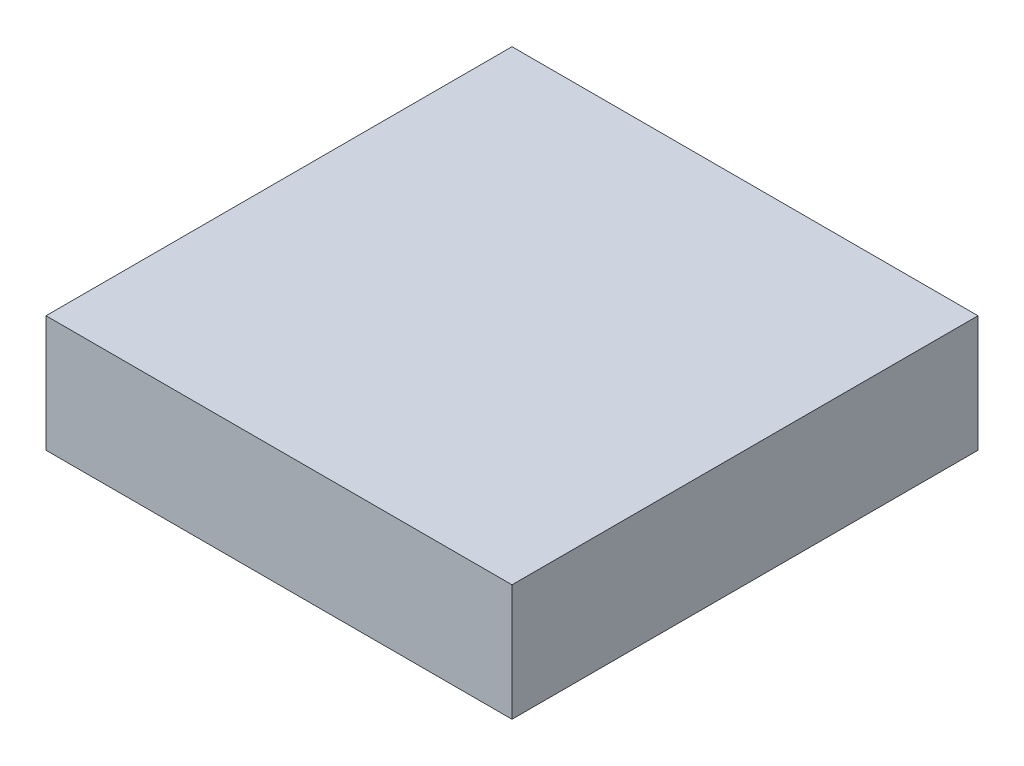
ISO-10303-21;
HEADER;
FILE_DESCRIPTION(('STEP AP214'),'2;1');
FILE_NAME('part.step','',(''),(''),'','','');
FILE_SCHEMA(('AUTOMOTIVE_DESIGN { 1 0 10303 214 1 1 1 1 }'));
ENDSEC;
DATA;
#1=APPLICATION_CONTEXT('core data for automotive mechanical design processes');
#2=APPLICATION_PROTOCOL_DEFINITION('international standard','automotive_design',2000,#1);
#3=PRODUCT_CONTEXT('',#1,'mechanical');
#4=PRODUCT('Part','Part','',(#3));
#5=PRODUCT_RELATED_PRODUCT_CATEGORY('part','',(#4));
#6=PRODUCT_DEFINITION_FORMATION('','',#4);
#7=PRODUCT_DEFINITION_CONTEXT('part definition',#1,'design');
#8=PRODUCT_DEFINITION('design','',#6,#7);
#9=PRODUCT_DEFINITION_SHAPE('','',#8);
#10=(LENGTH_UNIT() NAMED_UNIT(*) SI_UNIT(.MILLI.,.METRE.));
#11=(NAMED_UNIT(*) PLANE_ANGLE_UNIT() SI_UNIT($,.RADIAN.));
#12=(NAMED_UNIT(*) SI_UNIT($,.STERADIAN.) SOLID_ANGLE_UNIT());
#13=UNCERTAINTY_MEASURE_WITH_UNIT(LENGTH_MEASURE(1.E-05),#10,'distance_accuracy_value','');
#14=(GEOMETRIC_REPRESENTATION_CONTEXT(3) GLOBAL_UNCERTAINTY_ASSIGNED_CONTEXT((#13)) GLOBAL_UNIT_ASSIGNED_CONTEXT((#10,
#11,#12)) REPRESENTATION_CONTEXT('',''));
#15=CARTESIAN_POINT('',(0.,0.,0.));
#16=DIRECTION('',(0.,0.,1.));
#17=DIRECTION('',(1.,0.,0.));
#18=AXIS2_PLACEMENT_3D('',#15,#16,#17);
#19=CARTESIAN_POINT('',(0.,0.75,0.));
#20=DIRECTION('',(1.,0.,0.));
#21=DIRECTION('',(0.,0.,-1.));
#22=AXIS2_PLACEMENT_3D('',#19,#20,#21);
#23=PLANE('',#22);
#24=DIRECTION('',(0.,0.,1.));
#25=VECTOR('',#24,1.);
#26=CARTESIAN_POINT('',(0.,0.,0.));
#27=LINE('',#26,#25);
#28=CARTESIAN_POINT('',(0.,0.,-3.));
#29=VERTEX_POINT('',#28);
#30=CARTESIAN_POINT('',(0.,0.,0.));
#31=VERTEX_POINT('',#30);
#32=EDGE_CURVE('E95',#29,#31,#27,.T.);
#33=ORIENTED_EDGE('',*,*,#32,.T.);
#34=DIRECTION('',(0.,-1.,0.));
#35=VECTOR('',#34,1.);
#36=CARTESIAN_POINT('',(0.,0.75,0.));
#37=LINE('',#36,#35);
#38=CARTESIAN_POINT('',(0.,0.75,0.));
#39=VERTEX_POINT('',#38);
#40=EDGE_CURVE('E11',#39,#31,#37,.T.);
#41=ORIENTED_EDGE('',*,*,#40,.F.);
#42=DIRECTION('',(0.,0.,1.));
#43=VECTOR('',#42,1.);
#44=CARTESIAN_POINT('',(0.,0.75,0.));
#45=LINE('',#44,#43);
#46=CARTESIAN_POINT('',(0.,0.75,-3.));
#47=VERTEX_POINT('',#46);
#48=EDGE_CURVE('E83',#47,#39,#45,.T.);
#49=ORIENTED_EDGE('',*,*,#48,.F.);
#50=DIRECTION('',(0.,-1.,0.));
#51=VECTOR('',#50,1.);
#52=CARTESIAN_POINT('',(0.,0.75,-3.));
#53=LINE('',#52,#51);
#54=EDGE_CURVE('E91',#47,#29,#53,.T.);
#55=ORIENTED_EDGE('',*,*,#54,.T.);
#56=EDGE_LOOP('',(#33,#41,#49,#55));
#57=FACE_BOUND('',#56,.T.);
#58=ADVANCED_FACE('F32',(#57),#23,.F.);
#59=CARTESIAN_POINT('',(0.,0.75,0.));
#60=DIRECTION('',(0.,0.,-1.));
#61=DIRECTION('',(-1.,0.,0.));
#62=AXIS2_PLACEMENT_3D('',#59,#60,#61);
#63=PLANE('',#62);
#64=DIRECTION('',(1.,0.,0.));
#65=VECTOR('',#64,1.);
#66=CARTESIAN_POINT('',(0.,0.,0.));
#67=LINE('',#66,#65);
#68=CARTESIAN_POINT('',(3.,0.,0.));
#69=VERTEX_POINT('',#68);
#70=EDGE_CURVE('E87',#31,#69,#67,.T.);
#71=ORIENTED_EDGE('',*,*,#70,.T.);
#72=DIRECTION('',(0.,-1.,0.));
#73=VECTOR('',#72,1.);
#74=CARTESIAN_POINT('',(3.,0.75,0.));
#75=LINE('',#74,#73);
#76=CARTESIAN_POINT('',(3.,0.75,0.));
#77=VERTEX_POINT('',#76);
#78=EDGE_CURVE('E40',#77,#69,#75,.T.);
#79=ORIENTED_EDGE('',*,*,#78,.F.);
#80=DIRECTION('',(1.,0.,0.));
#81=VECTOR('',#80,1.);
#82=CARTESIAN_POINT('',(0.,0.75,0.));
#83=LINE('',#82,#81);
#84=EDGE_CURVE('E78',#39,#77,#83,.T.);
#85=ORIENTED_EDGE('',*,*,#84,.F.);
#86=ORIENTED_EDGE('',*,*,#40,.T.);
#87=EDGE_LOOP('',(#71,#79,#85,#86));
#88=FACE_BOUND('',#87,.T.);
#89=ADVANCED_FACE('F86',(#88),#63,.F.);
#90=CARTESIAN_POINT('',(3.,0.75,0.));
#91=DIRECTION('',(-1.,0.,0.));
#92=DIRECTION('',(0.,0.,1.));
#93=AXIS2_PLACEMENT_3D('',#90,#91,#92);
#94=PLANE('',#93);
#95=DIRECTION('',(0.,0.,-1.));
#96=VECTOR('',#95,1.);
#97=CARTESIAN_POINT('',(3.,0.,0.));
#98=LINE('',#97,#96);
#99=CARTESIAN_POINT('',(3.,0.,-3.));
#100=VERTEX_POINT('',#99);
#101=EDGE_CURVE('E65',#69,#100,#98,.T.);
#102=ORIENTED_EDGE('',*,*,#101,.T.);
#103=DIRECTION('',(0.,-1.,0.));
#104=VECTOR('',#103,1.);
#105=CARTESIAN_POINT('',(3.,0.75,-3.));
#106=LINE('',#105,#104);
#107=CARTESIAN_POINT('',(3.,0.75,-3.));
#108=VERTEX_POINT('',#107);
#109=EDGE_CURVE('E88',#108,#100,#106,.T.);
#110=ORIENTED_EDGE('',*,*,#109,.F.);
#111=DIRECTION('',(0.,0.,-1.));
#112=VECTOR('',#111,1.);
#113=CARTESIAN_POINT('',(3.,0.75,0.));
#114=LINE('',#113,#112);
#115=EDGE_CURVE('E81',#77,#108,#114,.T.);
#116=ORIENTED_EDGE('',*,*,#115,.F.);
#117=ORIENTED_EDGE('',*,*,#78,.T.);
#118=EDGE_LOOP('',(#102,#110,#116,#117));
#119=FACE_BOUND('',#118,.T.);
#120=ADVANCED_FACE('F89',(#119),#94,.F.);
#121=CARTESIAN_POINT('',(0.,0.75,-3.));
#122=DIRECTION('',(0.,0.,1.));
#123=DIRECTION('',(1.,0.,0.));
#124=AXIS2_PLACEMENT_3D('',#121,#122,#123);
#125=PLANE('',#124);
#126=DIRECTION('',(-1.,0.,0.));
#127=VECTOR('',#126,1.);
#128=CARTESIAN_POINT('',(0.,0.,-3.));
#129=LINE('',#128,#127);
#130=EDGE_CURVE('E71',#100,#29,#129,.T.);
#131=ORIENTED_EDGE('',*,*,#130,.T.);
#132=ORIENTED_EDGE('',*,*,#54,.F.);
#133=DIRECTION('',(-1.,0.,0.));
#134=VECTOR('',#133,1.);
#135=CARTESIAN_POINT('',(0.,0.75,-3.));
#136=LINE('',#135,#134);
#137=EDGE_CURVE('E48',#108,#47,#136,.T.);
#138=ORIENTED_EDGE('',*,*,#137,.F.);
#139=ORIENTED_EDGE('',*,*,#109,.T.);
#140=EDGE_LOOP('',(#131,#132,#138,#139));
#141=FACE_BOUND('',#140,.T.);
#142=ADVANCED_FACE('F102',(#141),#125,.F.);
#143=CARTESIAN_POINT('',(0.,0.75,0.));
#144=DIRECTION('',(0.,-1.,0.));
#145=DIRECTION('',(0.,0.,-1.));
#146=AXIS2_PLACEMENT_3D('',#143,#144,#145);
#147=PLANE('',#146);
#148=ORIENTED_EDGE('',*,*,#48,.T.);
#149=ORIENTED_EDGE('',*,*,#84,.T.);
#150=ORIENTED_EDGE('',*,*,#115,.T.);
#151=ORIENTED_EDGE('',*,*,#137,.T.);
#152=EDGE_LOOP('',(#148,#149,#150,#151));
#153=FACE_BOUND('',#152,.T.);
#154=ADVANCED_FACE('F79',(#153),#147,.F.);
#155=CARTESIAN_POINT('',(0.,0.,0.));
#156=DIRECTION('',(0.,-1.,0.));
#157=DIRECTION('',(0.,0.,-1.));
#158=AXIS2_PLACEMENT_3D('',#155,#156,#157);
#159=PLANE('',#158);
#160=ORIENTED_EDGE('',*,*,#32,.F.);
#161=ORIENTED_EDGE('',*,*,#130,.F.);
#162=ORIENTED_EDGE('',*,*,#101,.F.);
#163=ORIENTED_EDGE('',*,*,#70,.F.);
#164=EDGE_LOOP('',(#160,#161,#162,#163));
#165=FACE_BOUND('',#164,.T.);
#166=ADVANCED_FACE('F105',(#165),#159,.T.);
#167=CLOSED_SHELL('',(#58,#89,#120,#142,#154,#166));
#168=MANIFOLD_SOLID_BREP('B2',#167);
#169=ADVANCED_BREP_SHAPE_REPRESENTATION('',(#18,#168),#14);
#170=SHAPE_DEFINITION_REPRESENTATION(#9,#169);
ENDSEC;
END-ISO-10303-21;
